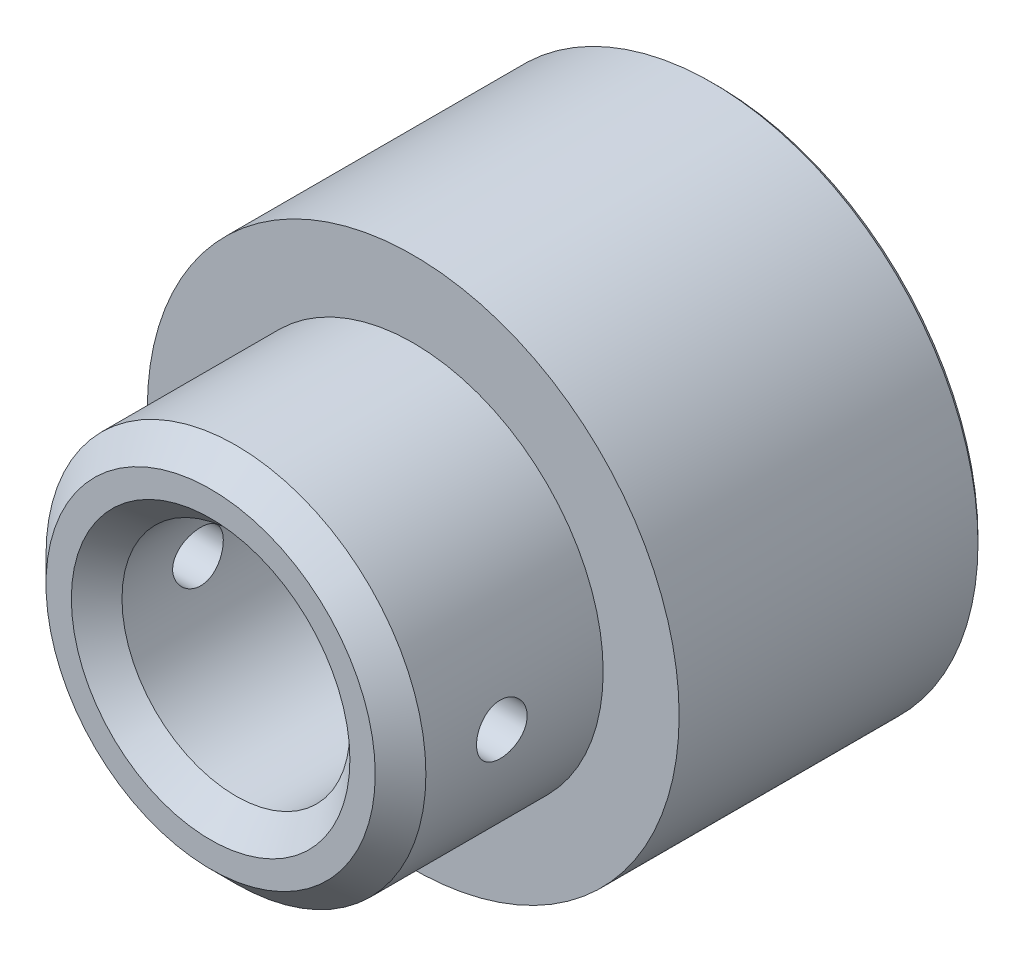
ISO-10303-21;
HEADER;
FILE_DESCRIPTION(('STEP AP214'),'2;1');
FILE_NAME('part.step','',(''),(''),'','','');
FILE_SCHEMA(('AUTOMOTIVE_DESIGN { 1 0 10303 214 1 1 1 1 }'));
ENDSEC;
DATA;
#1=APPLICATION_CONTEXT('core data for automotive mechanical design processes');
#2=APPLICATION_PROTOCOL_DEFINITION('international standard','automotive_design',2000,#1);
#3=PRODUCT_CONTEXT('',#1,'mechanical');
#4=PRODUCT('Part','Part','',(#3));
#5=PRODUCT_RELATED_PRODUCT_CATEGORY('part','',(#4));
#6=PRODUCT_DEFINITION_FORMATION('','',#4);
#7=PRODUCT_DEFINITION_CONTEXT('part definition',#1,'design');
#8=PRODUCT_DEFINITION('design','',#6,#7);
#9=PRODUCT_DEFINITION_SHAPE('','',#8);
#10=(LENGTH_UNIT() NAMED_UNIT(*) SI_UNIT(.MILLI.,.METRE.));
#11=(NAMED_UNIT(*) PLANE_ANGLE_UNIT() SI_UNIT($,.RADIAN.));
#12=(NAMED_UNIT(*) SI_UNIT($,.STERADIAN.) SOLID_ANGLE_UNIT());
#13=UNCERTAINTY_MEASURE_WITH_UNIT(LENGTH_MEASURE(1.E-05),#10,'distance_accuracy_value','');
#14=(GEOMETRIC_REPRESENTATION_CONTEXT(3) GLOBAL_UNCERTAINTY_ASSIGNED_CONTEXT((#13)) GLOBAL_UNIT_ASSIGNED_CONTEXT((#10,
#11,#12)) REPRESENTATION_CONTEXT('',''));
#15=CARTESIAN_POINT('',(0.,0.,0.));
#16=DIRECTION('',(0.,0.,1.));
#17=DIRECTION('',(1.,0.,0.));
#18=AXIS2_PLACEMENT_3D('',#15,#16,#17);
#19=CARTESIAN_POINT('',(0.,0.,60.));
#20=DIRECTION('',(0.,0.,-1.));
#21=DIRECTION('',(-1.,0.,0.));
#22=AXIS2_PLACEMENT_3D('',#19,#20,#21);
#23=CYLINDRICAL_SURFACE('',#22,52.5);
#24=CARTESIAN_POINT('',(0.,0.,0.999999999999994));
#25=DIRECTION('',(0.,0.,1.));
#26=DIRECTION('',(1.,0.,0.));
#27=AXIS2_PLACEMENT_3D('',#24,#25,#26);
#28=CIRCLE('',#27,52.5);
#29=CARTESIAN_POINT('',(52.5,0.,0.999999999999994));
#30=VERTEX_POINT('',#29);
#31=EDGE_CURVE('E155',#30,#30,#28,.T.);
#32=ORIENTED_EDGE('',*,*,#31,.T.);
#33=EDGE_LOOP('',(#32));
#34=FACE_BOUND('',#33,.T.);
#35=CARTESIAN_POINT('',(0.,0.,60.));
#36=DIRECTION('',(0.,0.,1.));
#37=DIRECTION('',(1.,0.,0.));
#38=AXIS2_PLACEMENT_3D('',#35,#36,#37);
#39=CIRCLE('',#38,52.5);
#40=CARTESIAN_POINT('',(52.5,0.,60.));
#41=VERTEX_POINT('',#40);
#42=EDGE_CURVE('E149',#41,#41,#39,.T.);
#43=ORIENTED_EDGE('',*,*,#42,.F.);
#44=EDGE_LOOP('',(#43));
#45=FACE_BOUND('',#44,.T.);
#46=ADVANCED_FACE('F33',(#34,#45),#23,.T.);
#47=CARTESIAN_POINT('',(0.,0.,60.));
#48=DIRECTION('',(0.,0.,1.));
#49=DIRECTION('',(1.,0.,0.));
#50=AXIS2_PLACEMENT_3D('',#47,#48,#49);
#51=PLANE('',#50);
#52=CARTESIAN_POINT('',(0.,0.,60.));
#53=DIRECTION('',(0.,0.,1.));
#54=DIRECTION('',(1.,0.,0.));
#55=AXIS2_PLACEMENT_3D('',#52,#53,#54);
#56=CIRCLE('',#55,37.5);
#57=CARTESIAN_POINT('',(37.5,0.,60.));
#58=VERTEX_POINT('',#57);
#59=EDGE_CURVE('E146',#58,#58,#56,.T.);
#60=ORIENTED_EDGE('',*,*,#59,.F.);
#61=EDGE_LOOP('',(#60));
#62=FACE_BOUND('',#61,.T.);
#63=ORIENTED_EDGE('',*,*,#42,.T.);
#64=EDGE_LOOP('',(#63));
#65=FACE_BOUND('',#64,.T.);
#66=ADVANCED_FACE('F96',(#62,#65),#51,.T.);
#67=CARTESIAN_POINT('',(0.,0.,0.));
#68=DIRECTION('',(0.,0.,1.));
#69=DIRECTION('',(1.,0.,0.));
#70=AXIS2_PLACEMENT_3D('',#67,#68,#69);
#71=PLANE('',#70);
#72=CARTESIAN_POINT('',(0.,0.,0.));
#73=DIRECTION('',(0.,0.,1.));
#74=DIRECTION('',(1.,0.,0.));
#75=AXIS2_PLACEMENT_3D('',#72,#73,#74);
#76=CIRCLE('',#75,51.5);
#77=CARTESIAN_POINT('',(51.5,0.,0.));
#78=VERTEX_POINT('',#77);
#79=EDGE_CURVE('E162',#78,#78,#76,.F.);
#80=ORIENTED_EDGE('',*,*,#79,.T.);
#81=EDGE_LOOP('',(#80));
#82=FACE_BOUND('',#81,.T.);
#83=CARTESIAN_POINT('',(0.,0.,0.));
#84=DIRECTION('',(0.,0.,1.));
#85=DIRECTION('',(1.,0.,0.));
#86=AXIS2_PLACEMENT_3D('',#83,#84,#85);
#87=CIRCLE('',#86,43.5);
#88=CARTESIAN_POINT('',(43.5,0.,0.));
#89=VERTEX_POINT('',#88);
#90=EDGE_CURVE('E159',#89,#89,#87,.T.);
#91=ORIENTED_EDGE('',*,*,#90,.T.);
#92=EDGE_LOOP('',(#91));
#93=FACE_BOUND('',#92,.T.);
#94=ADVANCED_FACE('F94',(#82,#93),#71,.F.);
#95=CARTESIAN_POINT('',(0.,0.,100.));
#96=DIRECTION('',(0.,0.,-1.));
#97=DIRECTION('',(-1.,0.,0.));
#98=AXIS2_PLACEMENT_3D('',#95,#96,#97);
#99=CYLINDRICAL_SURFACE('',#98,37.5);
#100=CARTESIAN_POINT('',(0.,0.,95.));
#101=DIRECTION('',(0.,0.,1.));
#102=DIRECTION('',(1.,0.,0.));
#103=AXIS2_PLACEMENT_3D('',#100,#101,#102);
#104=CIRCLE('',#103,37.5);
#105=CARTESIAN_POINT('',(37.5,0.,95.));
#106=VERTEX_POINT('',#105);
#107=EDGE_CURVE('E40',#106,#106,#104,.F.);
#108=ORIENTED_EDGE('',*,*,#107,.T.);
#109=EDGE_LOOP('',(#108));
#110=FACE_BOUND('',#109,.T.);
#111=CARTESIAN_POINT('',(-37.5,0.,85.));
#112=CARTESIAN_POINT('',(-37.5000006035784,-0.139809857161941,85.0000016964841));
#113=CARTESIAN_POINT('',(-37.4992166043786,-0.279595172641454,84.9941339147014));
#114=CARTESIAN_POINT('',(-37.4961038038827,-0.558209611683406,84.9707084393415));
#115=CARTESIAN_POINT('',(-37.4937746602546,-0.697038516461321,84.9531481552464));
#116=CARTESIAN_POINT('',(-37.4876339352639,-0.972801317522203,84.9064479289502));
#117=CARTESIAN_POINT('',(-37.483821279974,-1.10973376640755,84.8772995977261));
#118=CARTESIAN_POINT('',(-37.4748195285748,-1.38068148762459,84.8076284796766));
#119=CARTESIAN_POINT('',(-37.4696299281757,-1.51469567167939,84.7671015252497));
#120=CARTESIAN_POINT('',(-37.4580270104952,-1.77866517944389,84.6750261124037));
#121=CARTESIAN_POINT('',(-37.4516150142465,-1.90862471015347,84.6234895447968));
#122=CARTESIAN_POINT('',(-37.4377404728693,-2.16377442653378,84.5097226652735));
#123=CARTESIAN_POINT('',(-37.4302775409615,-2.28896283462189,84.4474884143851));
#124=CARTESIAN_POINT('',(-37.4145154352324,-2.53358466180885,84.3128218341247));
#125=CARTESIAN_POINT('',(-37.4062167138416,-2.65302114333451,84.2403950138577));
#126=CARTESIAN_POINT('',(-37.3890073442538,-2.88543153803738,84.085801110365));
#127=CARTESIAN_POINT('',(-37.3800964698529,-2.99840303368927,84.0036304183355));
#128=CARTESIAN_POINT('',(-37.3618659704914,-3.21762873248845,83.8296926062331));
#129=CARTESIAN_POINT('',(-37.3525444611663,-3.3238449556724,83.7378778118437));
#130=CARTESIAN_POINT('',(-37.3337946917017,-3.52821633618742,83.5456142115876));
#131=CARTESIAN_POINT('',(-37.3243663933499,-3.62636849713842,83.445162224501));
#132=CARTESIAN_POINT('',(-37.3056749300062,-3.81385543391411,83.2363845917573));
#133=CARTESIAN_POINT('',(-37.2964117139836,-3.90319297468565,83.1280614337407));
#134=CARTESIAN_POINT('',(-37.2783056025132,-4.07249114449238,82.9042236087622));
#135=CARTESIAN_POINT('',(-37.2694628633793,-4.15244830229266,82.7887063036434));
#136=CARTESIAN_POINT('',(-37.2524226807134,-4.30264336164983,82.5509027817785));
#137=CARTESIAN_POINT('',(-37.2442275986426,-4.37284634478348,82.428594334427));
#138=CARTESIAN_POINT('',(-37.228749776666,-4.50271791105839,82.1783959136371));
#139=CARTESIAN_POINT('',(-37.2214673767056,-4.56238257237184,82.0505038842631));
#140=CARTESIAN_POINT('',(-37.2080323864431,-4.67068653301889,81.7901256093804));
#141=CARTESIAN_POINT('',(-37.2018793411033,-4.71933027474225,81.6576412399027));
#142=CARTESIAN_POINT('',(-37.1908748711901,-4.80527579014029,81.3889764477635));
#143=CARTESIAN_POINT('',(-37.1860239242294,-4.84257340269532,81.2527946890044));
#144=CARTESIAN_POINT('',(-37.1737079392626,-4.93656175023383,80.8418942123888));
#145=CARTESIAN_POINT('',(-37.1683811858736,-4.97611579552635,80.5629679374244));
#146=CARTESIAN_POINT('',(-37.164113738729,-5.00788132323699,80.0025420291667));
#147=CARTESIAN_POINT('',(-37.1651727539045,-5.00009496347089,79.7210425137479));
#148=CARTESIAN_POINT('',(-37.1735145714914,-4.93768985074462,79.1652084601789));
#149=CARTESIAN_POINT('',(-37.1807567970259,-4.88337642057536,78.8908391995106));
#150=CARTESIAN_POINT('',(-37.2005886378971,-4.72991913360118,78.355154883806));
#151=CARTESIAN_POINT('',(-37.2131783751565,-4.63077425464099,78.0938401265626));
#152=CARTESIAN_POINT('',(-37.2423315766249,-4.39014795461965,77.5907267273243));
#153=CARTESIAN_POINT('',(-37.2589073661903,-4.24853487441533,77.3489917902115));
#154=CARTESIAN_POINT('',(-37.2941558924048,-3.92708490703946,76.8926020769972));
#155=CARTESIAN_POINT('',(-37.3128287380671,-3.74724603230753,76.6779487099343));
#156=CARTESIAN_POINT('',(-37.3503474843885,-3.35276223075558,76.2800425276878));
#157=CARTESIAN_POINT('',(-37.3691935894807,-3.13785426223238,76.0970504090859));
#158=CARTESIAN_POINT('',(-37.4047980945058,-2.68023543066728,75.7696948718373));
#159=CARTESIAN_POINT('',(-37.4215564884248,-2.43752448753739,75.6253315644671));
#160=CARTESIAN_POINT('',(-37.4511098438437,-1.93098054789413,75.379327209989));
#161=CARTESIAN_POINT('',(-37.4639031802894,-1.66713894671185,75.2777036734364));
#162=CARTESIAN_POINT('',(-37.4840706475363,-1.12592731123183,75.120276701517));
#163=CARTESIAN_POINT('',(-37.4914450672404,-0.848557998988532,75.0644708234184));
#164=CARTESIAN_POINT('',(-37.4999060344292,-0.290417258182221,75.0006039180554));
#165=CARTESIAN_POINT('',(-37.5010398461927,-0.00968758622736274,74.9921839944383));
#166=CARTESIAN_POINT('',(-37.4970197884964,0.549179042906562,75.0223791614209));
#167=CARTESIAN_POINT('',(-37.4918660718566,0.827316062935105,75.0609931088511));
#168=CARTESIAN_POINT('',(-37.4758793838114,1.37203428935979,75.1838616290813));
#169=CARTESIAN_POINT('',(-37.4650678570428,1.63865504284749,75.2679439044186));
#170=CARTESIAN_POINT('',(-37.4389752318875,2.15401274541647,75.4791824312302));
#171=CARTESIAN_POINT('',(-37.4236939629659,2.40274901169671,75.6063403262052));
#172=CARTESIAN_POINT('',(-37.3902459322604,2.87687220241664,75.9009803274296));
#173=CARTESIAN_POINT('',(-37.3720628686903,3.10211455798003,76.0686931840303));
#174=CARTESIAN_POINT('',(-37.3348932252024,3.52138234549022,76.4393585533241));
#175=CARTESIAN_POINT('',(-37.3159066088361,3.71540635947636,76.6423126658316));
#176=CARTESIAN_POINT('',(-37.2791225338362,4.06801381819454,77.0792819914668));
#177=CARTESIAN_POINT('',(-37.261333614562,4.22635849949015,77.3134906783304));
#178=CARTESIAN_POINT('',(-37.2291034298635,4.50145846771057,77.805401764145));
#179=CARTESIAN_POINT('',(-37.214662089687,4.61821468334676,78.0631036383088));
#180=CARTESIAN_POINT('',(-37.190819904382,4.80644706354516,78.5938810519869));
#181=CARTESIAN_POINT('',(-37.1814044018275,4.87805501107639,78.8669092908674));
#182=CARTESIAN_POINT('',(-37.168645171367,4.97436238892195,79.4214040000785));
#183=CARTESIAN_POINT('',(-37.1653011186887,4.99906432832376,79.7028700182387));
#184=CARTESIAN_POINT('',(-37.1651127634092,5.00042688871785,80.1237808661453));
#185=CARTESIAN_POINT('',(-37.165843851816,4.99501216960199,80.2633898740717));
#186=CARTESIAN_POINT('',(-37.1688591219892,4.97253184958063,80.5416357480289));
#187=CARTESIAN_POINT('',(-37.1711427243797,4.95547059498609,80.6802729572283));
#188=CARTESIAN_POINT('',(-37.1772010305187,4.90981100429212,80.9556423760262));
#189=CARTESIAN_POINT('',(-37.1809762749051,4.88120848504187,81.0923738762874));
#190=CARTESIAN_POINT('',(-37.1899068333592,4.81269401595574,81.3628764788086));
#191=CARTESIAN_POINT('',(-37.1950616463805,4.77278617180068,81.4966486368146));
#192=CARTESIAN_POINT('',(-37.2066042119064,4.68195430652272,81.7603258008377));
#193=CARTESIAN_POINT('',(-37.212991823618,4.63103154328916,81.8902312465029));
#194=CARTESIAN_POINT('',(-37.2268163237538,4.51855658876873,82.1452410946667));
#195=CARTESIAN_POINT('',(-37.2342528320251,4.4570082467209,82.2703472157864));
#196=CARTESIAN_POINT('',(-37.2499699958554,4.32368363022057,82.5149897801875));
#197=CARTESIAN_POINT('',(-37.2582509643222,4.25190356053781,82.6345241348163));
#198=CARTESIAN_POINT('',(-37.2754192205796,4.09866580761584,82.8671111884256));
#199=CARTESIAN_POINT('',(-37.2843062906605,4.01721159158497,82.9801661881948));
#200=CARTESIAN_POINT('',(-37.3025138234237,3.84448451679711,83.1999418631707));
#201=CARTESIAN_POINT('',(-37.3118371759042,3.75313857242223,83.3066048676036));
#202=CARTESIAN_POINT('',(-37.330584150837,3.56184184352336,83.5118305479989));
#203=CARTESIAN_POINT('',(-37.3400077358127,3.46189418245564,83.6103961390955));
#204=CARTESIAN_POINT('',(-37.3586991263206,3.25399690729604,83.798841802656));
#205=CARTESIAN_POINT('',(-37.367966834608,3.14604250986813,83.8887166080566));
#206=CARTESIAN_POINT('',(-37.3860766652253,2.92297556799256,84.0590516052954));
#207=CARTESIAN_POINT('',(-37.394918943501,2.80786568247649,84.1395152626033));
#208=CARTESIAN_POINT('',(-37.4119731315671,2.57069345067363,84.2908525870795));
#209=CARTESIAN_POINT('',(-37.4201818802072,2.44860094515718,84.3616793590073));
#210=CARTESIAN_POINT('',(-37.4356865483206,2.1988673779508,84.4927567149454));
#211=CARTESIAN_POINT('',(-37.4429828025999,2.07122837464114,84.5530111813588));
#212=CARTESIAN_POINT('',(-37.4564531746305,1.81135973412983,84.6624925810083));
#213=CARTESIAN_POINT('',(-37.462628150195,1.67913369918062,84.7117279509595));
#214=CARTESIAN_POINT('',(-37.473685750318,1.41098911378825,84.7988525254573));
#215=CARTESIAN_POINT('',(-37.4785686748438,1.27507142850613,84.8367443638282));
#216=CARTESIAN_POINT('',(-37.4883875197009,0.951549337616055,84.912341127651));
#217=CARTESIAN_POINT('',(-37.4927236192826,0.762768081383299,84.9451784824949));
#218=CARTESIAN_POINT('',(-37.4985294338594,0.382642552902599,84.9890066616871));
#219=CARTESIAN_POINT('',(-37.4999991741389,0.191298303278015,84.9999976787436));
#220=CARTESIAN_POINT('',(-37.5,0.,85.));
#221=B_SPLINE_CURVE_WITH_KNOTS('',3,(#111,#112,#113,#114,#115,#116,#117,#118,#119,#120,#121,
#122,#123,#124,#125,#126,#127,#128,#129,#130,#131,#132,#133,#134,#135,#136,#137,#138,#139,#140,
#141,#142,#143,#144,#145,#146,#147,#148,#149,#150,#151,#152,#153,#154,#155,#156,#157,#158,#159,
#160,#161,#162,#163,#164,#165,#166,#167,#168,#169,#170,#171,#172,#173,#174,#175,#176,#177,#178,
#179,#180,#181,#182,#183,#184,#185,#186,#187,#188,#189,#190,#191,#192,#193,#194,#195,#196,#197,
#198,#199,#200,#201,#202,#203,#204,#205,#206,#207,#208,#209,#210,#211,#212,#213,#214,#215,#216,
#217,#218,#219,#220),.UNSPECIFIED.,.T.,.F.,(4,2,2,2,2,2,2,2,2,2,2,2,2,2,2,2,2,2,2,2,2,2,2,2,2,2,
2,2,2,2,2,2,2,2,2,2,2,2,2,2,2,2,2,2,2,2,2,2,2,2,2,2,2,2,4),(0.,0.419262120559973,
0.838617161143729,1.25827634305797,1.67808943278332,2.09745137984392,2.51696807136685,
2.93625887795984,3.35570546372761,3.77733292157984,4.1991163424674,4.62076703599578,
5.04257327353928,5.46585261350656,5.8892891461461,6.31255469213693,6.73597528141105,
7.57687073511492,8.41772786037894,9.25310896470703,10.0885091166522,10.9265264157034,
11.7645872983509,12.6092504493772,13.4539160335633,14.2989273423194,15.1438935970495,
15.9824514620575,16.8209889461179,17.6563709221675,18.4917847748446,19.3320687065031,
20.172390793725,21.0181794506422,21.8639492190821,22.7072387056423,23.5504830818468,
23.9692230560844,24.3878068482622,24.806542493317,25.2251262634094,25.6436622569952,
26.0620469480099,26.4805872352611,26.8989779680289,27.3207035244164,27.7422765847367,
28.1641035594344,28.5857747123536,29.0094295472959,29.4329284789613,29.8561020430301,
30.2791772752092,30.8528481265814,31.4265139175347),.UNSPECIFIED.);
#222=CARTESIAN_POINT('',(-37.5,0.,85.));
#223=VERTEX_POINT('',#222);
#224=EDGE_CURVE('E84',#223,#223,#221,.T.);
#225=ORIENTED_EDGE('',*,*,#224,.T.);
#226=EDGE_LOOP('',(#225));
#227=FACE_BOUND('',#226,.T.);
#228=CARTESIAN_POINT('',(37.5,0.,75.));
#229=CARTESIAN_POINT('',(37.5000006035784,-0.139809857161942,74.9999983035159));
#230=CARTESIAN_POINT('',(37.4992166043786,-0.279595172641455,75.0058660852986));
#231=CARTESIAN_POINT('',(37.4961038038827,-0.558209611683408,75.0292915606585));
#232=CARTESIAN_POINT('',(37.4937746602546,-0.697038516461323,75.0468518447536));
#233=CARTESIAN_POINT('',(37.4876339352639,-0.972801317522204,75.0935520710498));
#234=CARTESIAN_POINT('',(37.483821279974,-1.10973376640755,75.1227004022739));
#235=CARTESIAN_POINT('',(37.4748195285748,-1.38068148762459,75.1923715203234));
#236=CARTESIAN_POINT('',(37.4696299281757,-1.51469567167939,75.2328984747503));
#237=CARTESIAN_POINT('',(37.4580270104952,-1.77866517944389,75.3249738875963));
#238=CARTESIAN_POINT('',(37.4516150142465,-1.90862471015347,75.3765104552032));
#239=CARTESIAN_POINT('',(37.4377404728693,-2.16377442653378,75.4902773347265));
#240=CARTESIAN_POINT('',(37.4302775409615,-2.28896283462189,75.5525115856149));
#241=CARTESIAN_POINT('',(37.4145154352324,-2.53358466180885,75.6871781658753));
#242=CARTESIAN_POINT('',(37.4062167138416,-2.65302114333451,75.7596049861423));
#243=CARTESIAN_POINT('',(37.3890073442538,-2.88543153803738,75.914198889635));
#244=CARTESIAN_POINT('',(37.3800964698529,-2.99840303368927,75.9963695816645));
#245=CARTESIAN_POINT('',(37.3618659704914,-3.21762873248845,76.1703073937669));
#246=CARTESIAN_POINT('',(37.3525444611663,-3.3238449556724,76.2621221881563));
#247=CARTESIAN_POINT('',(37.3337946917017,-3.52821633618742,76.4543857884124));
#248=CARTESIAN_POINT('',(37.3243663933499,-3.62636849713842,76.554837775499));
#249=CARTESIAN_POINT('',(37.3056749300062,-3.81385543391411,76.7636154082427));
#250=CARTESIAN_POINT('',(37.2964117139836,-3.90319297468565,76.8719385662593));
#251=CARTESIAN_POINT('',(37.2783056025132,-4.07249114449238,77.0957763912378));
#252=CARTESIAN_POINT('',(37.2694628633793,-4.15244830229265,77.2112936963566));
#253=CARTESIAN_POINT('',(37.2524226807134,-4.30264336164983,77.4490972182215));
#254=CARTESIAN_POINT('',(37.2442275986426,-4.37284634478348,77.571405665573));
#255=CARTESIAN_POINT('',(37.228749776666,-4.50271791105838,77.8216040863629));
#256=CARTESIAN_POINT('',(37.2214673767056,-4.56238257237183,77.9494961157369));
#257=CARTESIAN_POINT('',(37.2080323864431,-4.67068653301889,78.2098743906196));
#258=CARTESIAN_POINT('',(37.2018793411033,-4.71933027474225,78.3423587600973));
#259=CARTESIAN_POINT('',(37.1908748711901,-4.80527579014029,78.6110235522365));
#260=CARTESIAN_POINT('',(37.1860239242294,-4.84257340269532,78.7472053109956));
#261=CARTESIAN_POINT('',(37.1737079392626,-4.93656175023383,79.1581057876112));
#262=CARTESIAN_POINT('',(37.1683811858736,-4.97611579552634,79.4370320625756));
#263=CARTESIAN_POINT('',(37.164113738729,-5.00788132323699,79.9974579708333));
#264=CARTESIAN_POINT('',(37.1651727539045,-5.00009496347089,80.2789574862521));
#265=CARTESIAN_POINT('',(37.1735145714914,-4.93768985074462,80.8347915398211));
#266=CARTESIAN_POINT('',(37.1807567970259,-4.88337642057536,81.1091608004894));
#267=CARTESIAN_POINT('',(37.2005886378971,-4.72991913360118,81.6448451161941));
#268=CARTESIAN_POINT('',(37.2131783751565,-4.63077425464098,81.9061598734374));
#269=CARTESIAN_POINT('',(37.2423315766249,-4.39014795461965,82.4092732726757));
#270=CARTESIAN_POINT('',(37.2589073661903,-4.24853487441533,82.6510082097885));
#271=CARTESIAN_POINT('',(37.2941558924048,-3.92708490703946,83.1073979230028));
#272=CARTESIAN_POINT('',(37.3128287380671,-3.74724603230753,83.3220512900657));
#273=CARTESIAN_POINT('',(37.3503474843885,-3.35276223075558,83.7199574723122));
#274=CARTESIAN_POINT('',(37.3691935894807,-3.13785426223238,83.9029495909141));
#275=CARTESIAN_POINT('',(37.4047980945058,-2.68023543066728,84.2303051281627));
#276=CARTESIAN_POINT('',(37.4215564884248,-2.43752448753739,84.3746684355329));
#277=CARTESIAN_POINT('',(37.4511098438437,-1.93098054789413,84.620672790011));
#278=CARTESIAN_POINT('',(37.4639031802894,-1.66713894671185,84.7222963265636));
#279=CARTESIAN_POINT('',(37.4840706475363,-1.12592731123183,84.879723298483));
#280=CARTESIAN_POINT('',(37.4914450672404,-0.848557998988532,84.9355291765816));
#281=CARTESIAN_POINT('',(37.4999060344292,-0.290417258182221,84.9993960819446));
#282=CARTESIAN_POINT('',(37.5010398461927,-0.00968758622736274,85.0078160055617));
#283=CARTESIAN_POINT('',(37.4970197884964,0.549179042906562,84.9776208385791));
#284=CARTESIAN_POINT('',(37.4918660718566,0.827316062935105,84.9390068911489));
#285=CARTESIAN_POINT('',(37.4758793838114,1.37203428935979,84.8161383709187));
#286=CARTESIAN_POINT('',(37.4650678570428,1.63865504284749,84.7320560955814));
#287=CARTESIAN_POINT('',(37.4389752318875,2.15401274541647,84.5208175687698));
#288=CARTESIAN_POINT('',(37.4236939629659,2.40274901169671,84.3936596737948));
#289=CARTESIAN_POINT('',(37.3902459322604,2.87687220241664,84.0990196725704));
#290=CARTESIAN_POINT('',(37.3720628686903,3.10211455798003,83.9313068159697));
#291=CARTESIAN_POINT('',(37.3348932252024,3.52138234549022,83.5606414466759));
#292=CARTESIAN_POINT('',(37.3159066088361,3.71540635947636,83.3576873341685));
#293=CARTESIAN_POINT('',(37.2791225338362,4.06801381819454,82.9207180085332));
#294=CARTESIAN_POINT('',(37.261333614562,4.22635849949015,82.6865093216697));
#295=CARTESIAN_POINT('',(37.2291034298635,4.50145846771057,82.194598235855));
#296=CARTESIAN_POINT('',(37.214662089687,4.61821468334676,81.9368963616912));
#297=CARTESIAN_POINT('',(37.190819904382,4.80644706354516,81.4061189480131));
#298=CARTESIAN_POINT('',(37.1814044018275,4.87805501107639,81.1330907091326));
#299=CARTESIAN_POINT('',(37.168645171367,4.97436238892195,80.5785959999215));
#300=CARTESIAN_POINT('',(37.1653011186887,4.99906432832376,80.2971299817613));
#301=CARTESIAN_POINT('',(37.1651127634092,5.00042688871785,79.8762191338547));
#302=CARTESIAN_POINT('',(37.165843851816,4.99501216960199,79.7366101259283));
#303=CARTESIAN_POINT('',(37.1688591219892,4.97253184958063,79.4583642519712));
#304=CARTESIAN_POINT('',(37.1711427243797,4.95547059498609,79.3197270427717));
#305=CARTESIAN_POINT('',(37.1772010305187,4.90981100429212,79.0443576239738));
#306=CARTESIAN_POINT('',(37.1809762749051,4.88120848504187,78.9076261237126));
#307=CARTESIAN_POINT('',(37.1899068333592,4.81269401595574,78.6371235211914));
#308=CARTESIAN_POINT('',(37.1950616463805,4.77278617180069,78.5033513631855));
#309=CARTESIAN_POINT('',(37.2066042119064,4.68195430652272,78.2396741991623));
#310=CARTESIAN_POINT('',(37.212991823618,4.63103154328916,78.1097687534971));
#311=CARTESIAN_POINT('',(37.2268163237538,4.51855658876873,77.8547589053333));
#312=CARTESIAN_POINT('',(37.2342528320251,4.4570082467209,77.7296527842136));
#313=CARTESIAN_POINT('',(37.2499699958554,4.32368363022057,77.4850102198125));
#314=CARTESIAN_POINT('',(37.2582509643222,4.25190356053781,77.3654758651837));
#315=CARTESIAN_POINT('',(37.2754192205796,4.09866580761584,77.1328888115744));
#316=CARTESIAN_POINT('',(37.2843062906605,4.01721159158497,77.0198338118052));
#317=CARTESIAN_POINT('',(37.3025138234237,3.84448451679711,76.8000581368293));
#318=CARTESIAN_POINT('',(37.3118371759042,3.75313857242222,76.6933951323964));
#319=CARTESIAN_POINT('',(37.330584150837,3.56184184352335,76.4881694520011));
#320=CARTESIAN_POINT('',(37.3400077358127,3.46189418245564,76.3896038609045));
#321=CARTESIAN_POINT('',(37.3586991263206,3.25399690729603,76.201158197344));
#322=CARTESIAN_POINT('',(37.367966834608,3.14604250986812,76.1112833919434));
#323=CARTESIAN_POINT('',(37.3860766652253,2.92297556799255,75.9409483947046));
#324=CARTESIAN_POINT('',(37.394918943501,2.80786568247649,75.8604847373967));
#325=CARTESIAN_POINT('',(37.4119731315671,2.57069345067363,75.7091474129205));
#326=CARTESIAN_POINT('',(37.4201818802072,2.44860094515718,75.6383206409927));
#327=CARTESIAN_POINT('',(37.4356865483206,2.1988673779508,75.5072432850546));
#328=CARTESIAN_POINT('',(37.4429828025999,2.07122837464115,75.4469888186412));
#329=CARTESIAN_POINT('',(37.4564531746305,1.81135973412984,75.3375074189917));
#330=CARTESIAN_POINT('',(37.462628150195,1.67913369918062,75.2882720490405));
#331=CARTESIAN_POINT('',(37.473685750318,1.41098911378825,75.2011474745427));
#332=CARTESIAN_POINT('',(37.4785686748438,1.27507142850614,75.1632556361718));
#333=CARTESIAN_POINT('',(37.4883875197009,0.951549337616055,75.087658872349));
#334=CARTESIAN_POINT('',(37.4927236192826,0.762768081383299,75.0548215175051));
#335=CARTESIAN_POINT('',(37.4985294338594,0.382642552902599,75.0109933383129));
#336=CARTESIAN_POINT('',(37.4999991741389,0.191298303278015,75.0000023212564));
#337=CARTESIAN_POINT('',(37.5,0.,75.));
#338=B_SPLINE_CURVE_WITH_KNOTS('',3,(#228,#229,#230,#231,#232,#233,#234,#235,#236,#237,#238,
#239,#240,#241,#242,#243,#244,#245,#246,#247,#248,#249,#250,#251,#252,#253,#254,#255,#256,#257,
#258,#259,#260,#261,#262,#263,#264,#265,#266,#267,#268,#269,#270,#271,#272,#273,#274,#275,#276,
#277,#278,#279,#280,#281,#282,#283,#284,#285,#286,#287,#288,#289,#290,#291,#292,#293,#294,#295,
#296,#297,#298,#299,#300,#301,#302,#303,#304,#305,#306,#307,#308,#309,#310,#311,#312,#313,#314,
#315,#316,#317,#318,#319,#320,#321,#322,#323,#324,#325,#326,#327,#328,#329,#330,#331,#332,#333,
#334,#335,#336,#337),.UNSPECIFIED.,.T.,.F.,(4,2,2,2,2,2,2,2,2,2,2,2,2,2,2,2,2,2,2,2,2,2,2,2,2,2,
2,2,2,2,2,2,2,2,2,2,2,2,2,2,2,2,2,2,2,2,2,2,2,2,2,2,2,2,4),(0.,0.419262120559974,
0.838617161143731,1.25827634305797,1.67808943278332,2.09745137984392,2.51696807136685,
2.93625887795984,3.35570546372761,3.77733292157984,4.1991163424674,4.62076703599578,
5.04257327353928,5.46585261350653,5.88928914614608,6.31255469213693,6.73597528141105,
7.57687073511491,8.41772786037894,9.25310896470704,10.0885091166522,10.9265264157034,
11.7645872983509,12.6092504493772,13.4539160335633,14.2989273423194,15.1438935970495,
15.9824514620575,16.8209889461179,17.6563709221675,18.4917847748446,19.3320687065031,
20.172390793725,21.0181794506422,21.8639492190821,22.7072387056423,23.5504830818468,
23.9692230560844,24.3878068482621,24.8065424933169,25.2251262634094,25.6436622569952,
26.0620469480099,26.4805872352611,26.8989779680289,27.3207035244165,27.7422765847367,
28.1641035594344,28.5857747123536,29.0094295472959,29.4329284789613,29.8561020430301,
30.2791772752092,30.8528481265814,31.4265139175347),.UNSPECIFIED.);
#339=CARTESIAN_POINT('',(37.5,0.,75.));
#340=VERTEX_POINT('',#339);
#341=EDGE_CURVE('E61',#340,#340,#338,.T.);
#342=ORIENTED_EDGE('',*,*,#341,.T.);
#343=EDGE_LOOP('',(#342));
#344=FACE_BOUND('',#343,.T.);
#345=ORIENTED_EDGE('',*,*,#59,.T.);
#346=EDGE_LOOP('',(#345));
#347=FACE_BOUND('',#346,.T.);
#348=ADVANCED_FACE('F88',(#110,#227,#344,#347),#99,.T.);
#349=CARTESIAN_POINT('',(0.,0.,100.));
#350=DIRECTION('',(0.,0.,1.));
#351=DIRECTION('',(1.,0.,0.));
#352=AXIS2_PLACEMENT_3D('',#349,#350,#351);
#353=PLANE('',#352);
#354=CARTESIAN_POINT('',(0.,0.,100.));
#355=DIRECTION('',(0.,0.,1.));
#356=DIRECTION('',(1.,0.,0.));
#357=AXIS2_PLACEMENT_3D('',#354,#355,#356);
#358=CIRCLE('',#357,32.5);
#359=CARTESIAN_POINT('',(32.5,0.,100.));
#360=VERTEX_POINT('',#359);
#361=EDGE_CURVE('E44',#360,#360,#358,.T.);
#362=ORIENTED_EDGE('',*,*,#361,.T.);
#363=EDGE_LOOP('',(#362));
#364=FACE_BOUND('',#363,.T.);
#365=CARTESIAN_POINT('',(0.,0.,100.));
#366=DIRECTION('',(0.,0.,1.));
#367=DIRECTION('',(1.,0.,0.));
#368=AXIS2_PLACEMENT_3D('',#365,#366,#367);
#369=CIRCLE('',#368,27.5);
#370=CARTESIAN_POINT('',(27.5,0.,100.));
#371=VERTEX_POINT('',#370);
#372=EDGE_CURVE('E48',#371,#371,#369,.F.);
#373=ORIENTED_EDGE('',*,*,#372,.T.);
#374=EDGE_LOOP('',(#373));
#375=FACE_BOUND('',#374,.T.);
#376=ADVANCED_FACE('F93',(#364,#375),#353,.T.);
#377=CARTESIAN_POINT('',(0.,0.,40.));
#378=DIRECTION('',(0.,0.,-1.));
#379=DIRECTION('',(-1.,0.,0.));
#380=AXIS2_PLACEMENT_3D('',#377,#378,#379);
#381=CYLINDRICAL_SURFACE('',#380,42.5);
#382=CARTESIAN_POINT('',(0.,0.,1.00000000000001));
#383=DIRECTION('',(0.,0.,1.));
#384=DIRECTION('',(1.,0.,0.));
#385=AXIS2_PLACEMENT_3D('',#382,#383,#384);
#386=CIRCLE('',#385,42.5);
#387=CARTESIAN_POINT('',(42.5,0.,1.00000000000001));
#388=VERTEX_POINT('',#387);
#389=EDGE_CURVE('E53',#388,#388,#386,.F.);
#390=ORIENTED_EDGE('',*,*,#389,.T.);
#391=EDGE_LOOP('',(#390));
#392=FACE_BOUND('',#391,.T.);
#393=CARTESIAN_POINT('',(0.,0.,40.));
#394=DIRECTION('',(0.,0.,-1.));
#395=DIRECTION('',(-1.,0.,0.));
#396=AXIS2_PLACEMENT_3D('',#393,#394,#395);
#397=CIRCLE('',#396,42.5);
#398=CARTESIAN_POINT('',(-42.5,0.,40.));
#399=VERTEX_POINT('',#398);
#400=EDGE_CURVE('E144',#399,#399,#397,.T.);
#401=ORIENTED_EDGE('',*,*,#400,.F.);
#402=EDGE_LOOP('',(#401));
#403=FACE_BOUND('',#402,.T.);
#404=ADVANCED_FACE('F127',(#392,#403),#381,.F.);
#405=CARTESIAN_POINT('',(0.,0.,40.));
#406=DIRECTION('',(0.,0.,-1.));
#407=DIRECTION('',(-1.,0.,0.));
#408=AXIS2_PLACEMENT_3D('',#405,#406,#407);
#409=PLANE('',#408);
#410=CARTESIAN_POINT('',(0.,0.,40.));
#411=DIRECTION('',(0.,0.,-1.));
#412=DIRECTION('',(-1.,0.,0.));
#413=AXIS2_PLACEMENT_3D('',#410,#411,#412);
#414=CIRCLE('',#413,22.5);
#415=CARTESIAN_POINT('',(-22.5,0.,40.));
#416=VERTEX_POINT('',#415);
#417=EDGE_CURVE('E147',#416,#416,#414,.T.);
#418=ORIENTED_EDGE('',*,*,#417,.F.);
#419=EDGE_LOOP('',(#418));
#420=FACE_BOUND('',#419,.T.);
#421=ORIENTED_EDGE('',*,*,#400,.T.);
#422=EDGE_LOOP('',(#421));
#423=FACE_BOUND('',#422,.T.);
#424=ADVANCED_FACE('F133',(#420,#423),#409,.T.);
#425=CARTESIAN_POINT('',(0.,0.,0.));
#426=DIRECTION('',(0.,0.,1.));
#427=DIRECTION('',(1.,0.,0.));
#428=AXIS2_PLACEMENT_3D('',#425,#426,#427);
#429=CYLINDRICAL_SURFACE('',#428,22.5);
#430=CARTESIAN_POINT('',(0.,0.,95.));
#431=DIRECTION('',(0.,0.,1.));
#432=DIRECTION('',(1.,0.,0.));
#433=AXIS2_PLACEMENT_3D('',#430,#431,#432);
#434=CIRCLE('',#433,22.5);
#435=CARTESIAN_POINT('',(22.5,0.,95.));
#436=VERTEX_POINT('',#435);
#437=EDGE_CURVE('E10',#436,#436,#434,.T.);
#438=ORIENTED_EDGE('',*,*,#437,.T.);
#439=EDGE_LOOP('',(#438));
#440=FACE_BOUND('',#439,.T.);
#441=CARTESIAN_POINT('',(22.5,0.,75.));
#442=CARTESIAN_POINT('',(22.4999949054563,0.277201191939121,75.0000093091996));
#443=CARTESIAN_POINT('',(22.4948253498923,0.554513913174051,75.0231299541587));
#444=CARTESIAN_POINT('',(22.4747024439418,1.10125486025784,75.1149011808764));
#445=CARTESIAN_POINT('',(22.4597422554339,1.37067743784747,75.1835835850232));
#446=CARTESIAN_POINT('',(22.421702829225,1.89365819440382,75.3642149262291));
#447=CARTESIAN_POINT('',(22.3986322109764,2.14723288025071,75.4761179424947));
#448=CARTESIAN_POINT('',(22.3468583860351,2.6320004507844,75.739866531181));
#449=CARTESIAN_POINT('',(22.3181552886865,2.86319376983337,75.8917113282266));
#450=CARTESIAN_POINT('',(22.2577273543527,3.30046578503508,76.2336891627666));
#451=CARTESIAN_POINT('',(22.2259640410261,3.50612153010881,76.4243562553376));
#452=CARTESIAN_POINT('',(22.1632650270043,3.88281227614596,76.8374201502331));
#453=CARTESIAN_POINT('',(22.132329402237,4.0538441102715,77.059819851777));
#454=CARTESIAN_POINT('',(22.0744082065066,4.35831108525865,77.5331796101448));
#455=CARTESIAN_POINT('',(22.0474718934386,4.49129355260967,77.7844373951004));
#456=CARTESIAN_POINT('',(22.0011524089458,4.71298247386312,78.3064319042344));
#457=CARTESIAN_POINT('',(21.9817683031266,4.80169440550397,78.5771662137733));
#458=CARTESIAN_POINT('',(21.9531402359799,4.93092145016118,79.1258336933053));
#459=CARTESIAN_POINT('',(21.9437386433446,4.97218667594938,79.4035817877401));
#460=CARTESIAN_POINT('',(21.9356668414216,5.00768177493916,79.9622055444361));
#461=CARTESIAN_POINT('',(21.9369952689832,5.00191762279196,80.2430808048922));
#462=CARTESIAN_POINT('',(21.9500908041844,4.94412068793337,80.794391567986));
#463=CARTESIAN_POINT('',(21.9616607847499,4.89296161150565,81.0649240603488));
#464=CARTESIAN_POINT('',(21.993623854663,4.74721226702843,81.5934678583121));
#465=CARTESIAN_POINT('',(22.0140174532947,4.65261949204123,81.8514784402134));
#466=CARTESIAN_POINT('',(22.0615227492924,4.42189182182193,82.3500985959548));
#467=CARTESIAN_POINT('',(22.0886881090716,4.28542298448384,82.5905483183402));
#468=CARTESIAN_POINT('',(22.1466434477592,3.97505170349623,83.0454571762897));
#469=CARTESIAN_POINT('',(22.1774339355124,3.80114400185686,83.2599126545503));
#470=CARTESIAN_POINT('',(22.2400143653192,3.41621709257458,83.6617732733712));
#471=CARTESIAN_POINT('',(22.2718112671975,3.20445551316559,83.8484669627626));
#472=CARTESIAN_POINT('',(22.3321959780572,2.75226654522906,84.1838093222678));
#473=CARTESIAN_POINT('',(22.3607837252105,2.51183860459343,84.3324572594547));
#474=CARTESIAN_POINT('',(22.4116266058404,2.00825797683685,84.587673189442));
#475=CARTESIAN_POINT('',(22.4338673251915,1.74505530579965,84.6941456107706));
#476=CARTESIAN_POINT('',(22.4694034091563,1.20388982745365,84.8611525326447));
#477=CARTESIAN_POINT('',(22.4827001174196,0.925929243983424,84.9216939335353));
#478=CARTESIAN_POINT('',(22.4986579440418,0.36923870820212,84.9940800331379));
#479=CARTESIAN_POINT('',(22.5015312155572,0.0906409932972702,85.0068962504042));
#480=CARTESIAN_POINT('',(22.496913966265,-0.464714809820195,84.9861047393491));
#481=CARTESIAN_POINT('',(22.4894241722617,-0.741473025676614,84.9525002667014));
#482=CARTESIAN_POINT('',(22.4650564689652,-1.28205814332355,84.8406264620798));
#483=CARTESIAN_POINT('',(22.4482861751934,-1.54599622928869,84.7628688594414));
#484=CARTESIAN_POINT('',(22.4072355271705,-2.05708201463958,84.5654657813873));
#485=CARTESIAN_POINT('',(22.3829545191188,-2.30422825002547,84.4458166592349));
#486=CARTESIAN_POINT('',(22.3290538306887,-2.77871609973591,84.1660178080027));
#487=CARTESIAN_POINT('',(22.2993611147475,-3.00571432708048,84.005300142485));
#488=CARTESIAN_POINT('',(22.2380758087357,-3.42986741247042,83.648671877246));
#489=CARTESIAN_POINT('',(22.2064829637869,-3.62701825433579,83.4527565491682));
#490=CARTESIAN_POINT('',(22.1442219736121,-3.98973870477415,83.0268299160498));
#491=CARTESIAN_POINT('',(22.1135829414823,-4.1546345485,82.7962397749894));
#492=CARTESIAN_POINT('',(22.0573848845825,-4.44336529807064,82.3100699139671));
#493=CARTESIAN_POINT('',(22.0318256378478,-4.56720199818121,82.0544912866228));
#494=CARTESIAN_POINT('',(21.9889300132591,-4.76945004740288,81.5269792772506));
#495=CARTESIAN_POINT('',(21.9715469897688,-4.84811965884861,81.255148894392));
#496=CARTESIAN_POINT('',(21.9468912408989,-4.95855069144011,80.7016895379163));
#497=CARTESIAN_POINT('',(21.9396168385988,-4.99031989295584,80.4200621974653));
#498=CARTESIAN_POINT('',(21.936110036307,-5.00570891602905,79.8618028042766));
#499=CARTESIAN_POINT('',(21.9396324581123,-4.99039782859127,79.5852012298064));
#500=CARTESIAN_POINT('',(21.956766622574,-4.91445692803306,79.0386257250505));
#501=CARTESIAN_POINT('',(21.9703782383105,-4.85382768500486,78.7686517114357));
#502=CARTESIAN_POINT('',(22.0060357036517,-4.6894954995219,78.243877199444));
#503=CARTESIAN_POINT('',(22.0280501296667,-4.58595291571223,77.9890242077993));
#504=CARTESIAN_POINT('',(22.078044111629,-4.33886925870768,77.5001500186299));
#505=CARTESIAN_POINT('',(22.1060243118894,-4.19532386462961,77.2661310750891));
#506=CARTESIAN_POINT('',(22.1655260709102,-3.8687839747642,76.820308477631));
#507=CARTESIAN_POINT('',(22.1971092842007,-3.68502963777603,76.6090694876936));
#508=CARTESIAN_POINT('',(22.2598493543275,-3.28482176486253,76.2200748151714));
#509=CARTESIAN_POINT('',(22.2910061107244,-3.06836066558357,76.0423268987289));
#510=CARTESIAN_POINT('',(22.3498814931665,-2.60536492661394,75.7230600427003));
#511=CARTESIAN_POINT('',(22.3775480874812,-2.35846409158738,75.5820620006627));
#512=CARTESIAN_POINT('',(22.4258014592307,-1.84390069944705,75.343791739547));
#513=CARTESIAN_POINT('',(22.4463940817703,-1.5762555082825,75.2464833998846));
#514=CARTESIAN_POINT('',(22.474570322739,-1.09034561932353,75.115396624308));
#515=CARTESIAN_POINT('',(22.4840467255803,-0.874679979754211,75.0722065658343));
#516=CARTESIAN_POINT('',(22.4967634364947,-0.439366124736323,75.0145052392346));
#517=CARTESIAN_POINT('',(22.5000040380903,-0.219718097232197,74.9999926212452));
#518=CARTESIAN_POINT('',(22.5,0.,75.));
#519=B_SPLINE_CURVE_WITH_KNOTS('',3,(#441,#442,#443,#444,#445,#446,#447,#448,#449,#450,#451,
#452,#453,#454,#455,#456,#457,#458,#459,#460,#461,#462,#463,#464,#465,#466,#467,#468,#469,#470,
#471,#472,#473,#474,#475,#476,#477,#478,#479,#480,#481,#482,#483,#484,#485,#486,#487,#488,#489,
#490,#491,#492,#493,#494,#495,#496,#497,#498,#499,#500,#501,#502,#503,#504,#505,#506,#507,#508,
#509,#510,#511,#512,#513,#514,#515,#516,#517,#518),.UNSPECIFIED.,.T.,.F.,(4,2,2,2,2,2,2,2,2,2,2,
2,2,2,2,2,2,2,2,2,2,2,2,2,2,2,2,2,2,2,2,2,2,2,2,2,2,2,4),(0.,0.830799224324493,1.66217932812321,
2.49267853101864,3.32316161292473,4.16595180005198,5.00881903726285,5.86133240744939,
6.71374026719351,7.55247814098694,8.39110946248412,9.21394170371395,10.0368214437428,
10.8664417428089,11.6961786315268,12.5444544952938,13.392746699315,14.2429503203503,
15.093026187619,15.9256998031761,16.758315022876,17.5814717356985,18.4047001237058,
19.2399950816204,20.0754023347633,20.9267368277126,21.7780341128296,22.6244139764775,
23.4706534172859,24.2978196287089,25.1249754347416,25.9490678005647,26.7732492148298,
27.6146081579908,28.4561619618304,29.3090646764094,30.1612609469436,30.8198086841341,
31.478325422369),.UNSPECIFIED.);
#520=CARTESIAN_POINT('',(22.5,0.,75.));
#521=VERTEX_POINT('',#520);
#522=EDGE_CURVE('E54',#521,#521,#519,.T.);
#523=ORIENTED_EDGE('',*,*,#522,.T.);
#524=EDGE_LOOP('',(#523));
#525=FACE_BOUND('',#524,.T.);
#526=CARTESIAN_POINT('',(-22.5,0.,75.));
#527=CARTESIAN_POINT('',(-22.4999949054563,-0.277201191939121,75.0000093091996));
#528=CARTESIAN_POINT('',(-22.4948253498923,-0.554513913174051,75.0231299541587));
#529=CARTESIAN_POINT('',(-22.4747024439418,-1.10125486025784,75.1149011808764));
#530=CARTESIAN_POINT('',(-22.4597422554339,-1.37067743784747,75.1835835850232));
#531=CARTESIAN_POINT('',(-22.421702829225,-1.89365819440382,75.3642149262291));
#532=CARTESIAN_POINT('',(-22.3986322109764,-2.14723288025071,75.4761179424947));
#533=CARTESIAN_POINT('',(-22.3468583860351,-2.6320004507844,75.739866531181));
#534=CARTESIAN_POINT('',(-22.3181552886865,-2.86319376983337,75.8917113282266));
#535=CARTESIAN_POINT('',(-22.2577273543527,-3.30046578503508,76.2336891627666));
#536=CARTESIAN_POINT('',(-22.2259640410261,-3.50612153010881,76.4243562553376));
#537=CARTESIAN_POINT('',(-22.1632650270043,-3.88281227614596,76.8374201502331));
#538=CARTESIAN_POINT('',(-22.132329402237,-4.0538441102715,77.059819851777));
#539=CARTESIAN_POINT('',(-22.0744082065066,-4.35831108525865,77.5331796101448));
#540=CARTESIAN_POINT('',(-22.0474718934386,-4.49129355260967,77.7844373951004));
#541=CARTESIAN_POINT('',(-22.0011524089458,-4.71298247386312,78.3064319042344));
#542=CARTESIAN_POINT('',(-21.9817683031266,-4.80169440550397,78.5771662137733));
#543=CARTESIAN_POINT('',(-21.9531402359799,-4.93092145016118,79.1258336933053));
#544=CARTESIAN_POINT('',(-21.9437386433446,-4.97218667594938,79.4035817877401));
#545=CARTESIAN_POINT('',(-21.9356668414216,-5.00768177493916,79.9622055444361));
#546=CARTESIAN_POINT('',(-21.9369952689832,-5.00191762279196,80.2430808048922));
#547=CARTESIAN_POINT('',(-21.9500908041844,-4.94412068793337,80.794391567986));
#548=CARTESIAN_POINT('',(-21.9616607847499,-4.89296161150565,81.0649240603488));
#549=CARTESIAN_POINT('',(-21.993623854663,-4.74721226702843,81.5934678583121));
#550=CARTESIAN_POINT('',(-22.0140174532947,-4.65261949204123,81.8514784402134));
#551=CARTESIAN_POINT('',(-22.0615227492924,-4.42189182182193,82.3500985959548));
#552=CARTESIAN_POINT('',(-22.0886881090716,-4.28542298448384,82.5905483183402));
#553=CARTESIAN_POINT('',(-22.1466434477592,-3.97505170349623,83.0454571762897));
#554=CARTESIAN_POINT('',(-22.1774339355124,-3.80114400185686,83.2599126545503));
#555=CARTESIAN_POINT('',(-22.2400143653192,-3.41621709257458,83.6617732733712));
#556=CARTESIAN_POINT('',(-22.2718112671975,-3.20445551316559,83.8484669627626));
#557=CARTESIAN_POINT('',(-22.3321959780572,-2.75226654522906,84.1838093222678));
#558=CARTESIAN_POINT('',(-22.3607837252105,-2.51183860459343,84.3324572594547));
#559=CARTESIAN_POINT('',(-22.4116266058404,-2.00825797683685,84.587673189442));
#560=CARTESIAN_POINT('',(-22.4338673251915,-1.74505530579965,84.6941456107706));
#561=CARTESIAN_POINT('',(-22.4694034091563,-1.20388982745365,84.8611525326447));
#562=CARTESIAN_POINT('',(-22.4827001174196,-0.925929243983424,84.9216939335353));
#563=CARTESIAN_POINT('',(-22.4986579440418,-0.36923870820212,84.9940800331379));
#564=CARTESIAN_POINT('',(-22.5015312155572,-0.0906409932972702,85.0068962504042));
#565=CARTESIAN_POINT('',(-22.496913966265,0.464714809820195,84.9861047393491));
#566=CARTESIAN_POINT('',(-22.4894241722617,0.741473025676614,84.9525002667014));
#567=CARTESIAN_POINT('',(-22.4650564689652,1.28205814332355,84.8406264620798));
#568=CARTESIAN_POINT('',(-22.4482861751934,1.54599622928869,84.7628688594414));
#569=CARTESIAN_POINT('',(-22.4072355271705,2.05708201463958,84.5654657813873));
#570=CARTESIAN_POINT('',(-22.3829545191188,2.30422825002547,84.4458166592349));
#571=CARTESIAN_POINT('',(-22.3290538306887,2.77871609973591,84.1660178080027));
#572=CARTESIAN_POINT('',(-22.2993611147475,3.00571432708048,84.005300142485));
#573=CARTESIAN_POINT('',(-22.2380758087357,3.42986741247042,83.648671877246));
#574=CARTESIAN_POINT('',(-22.2064829637869,3.62701825433579,83.4527565491682));
#575=CARTESIAN_POINT('',(-22.1442219736121,3.98973870477415,83.0268299160498));
#576=CARTESIAN_POINT('',(-22.1135829414823,4.1546345485,82.7962397749894));
#577=CARTESIAN_POINT('',(-22.0573848845825,4.44336529807064,82.3100699139671));
#578=CARTESIAN_POINT('',(-22.0318256378478,4.56720199818121,82.0544912866228));
#579=CARTESIAN_POINT('',(-21.9889300132591,4.76945004740288,81.5269792772506));
#580=CARTESIAN_POINT('',(-21.9715469897688,4.84811965884861,81.255148894392));
#581=CARTESIAN_POINT('',(-21.9468912408989,4.95855069144011,80.7016895379163));
#582=CARTESIAN_POINT('',(-21.9396168385988,4.99031989295584,80.4200621974653));
#583=CARTESIAN_POINT('',(-21.936110036307,5.00570891602905,79.8618028042766));
#584=CARTESIAN_POINT('',(-21.9396324581123,4.99039782859127,79.5852012298064));
#585=CARTESIAN_POINT('',(-21.956766622574,4.91445692803306,79.0386257250505));
#586=CARTESIAN_POINT('',(-21.9703782383105,4.85382768500486,78.7686517114357));
#587=CARTESIAN_POINT('',(-22.0060357036517,4.6894954995219,78.243877199444));
#588=CARTESIAN_POINT('',(-22.0280501296667,4.58595291571223,77.9890242077993));
#589=CARTESIAN_POINT('',(-22.078044111629,4.33886925870768,77.5001500186299));
#590=CARTESIAN_POINT('',(-22.1060243118894,4.19532386462961,77.2661310750891));
#591=CARTESIAN_POINT('',(-22.1655260709102,3.8687839747642,76.820308477631));
#592=CARTESIAN_POINT('',(-22.1971092842007,3.68502963777603,76.6090694876936));
#593=CARTESIAN_POINT('',(-22.2598493543275,3.28482176486253,76.2200748151714));
#594=CARTESIAN_POINT('',(-22.2910061107244,3.06836066558357,76.0423268987289));
#595=CARTESIAN_POINT('',(-22.3498814931665,2.60536492661394,75.7230600427003));
#596=CARTESIAN_POINT('',(-22.3775480874812,2.35846409158738,75.5820620006627));
#597=CARTESIAN_POINT('',(-22.4258014592307,1.84390069944705,75.343791739547));
#598=CARTESIAN_POINT('',(-22.4463940817703,1.5762555082825,75.2464833998846));
#599=CARTESIAN_POINT('',(-22.474570322739,1.09034561932353,75.115396624308));
#600=CARTESIAN_POINT('',(-22.4840467255803,0.874679979754211,75.0722065658343));
#601=CARTESIAN_POINT('',(-22.4967634364947,0.439366124736323,75.0145052392346));
#602=CARTESIAN_POINT('',(-22.5000040380903,0.219718097232197,74.9999926212452));
#603=CARTESIAN_POINT('',(-22.5,0.,75.));
#604=B_SPLINE_CURVE_WITH_KNOTS('',3,(#526,#527,#528,#529,#530,#531,#532,#533,#534,#535,#536,
#537,#538,#539,#540,#541,#542,#543,#544,#545,#546,#547,#548,#549,#550,#551,#552,#553,#554,#555,
#556,#557,#558,#559,#560,#561,#562,#563,#564,#565,#566,#567,#568,#569,#570,#571,#572,#573,#574,
#575,#576,#577,#578,#579,#580,#581,#582,#583,#584,#585,#586,#587,#588,#589,#590,#591,#592,#593,
#594,#595,#596,#597,#598,#599,#600,#601,#602,#603),.UNSPECIFIED.,.T.,.F.,(4,2,2,2,2,2,2,2,2,2,2,
2,2,2,2,2,2,2,2,2,2,2,2,2,2,2,2,2,2,2,2,2,2,2,2,2,2,2,4),(0.,0.830799224324493,1.66217932812321,
2.49267853101864,3.32316161292473,4.16595180005198,5.00881903726285,5.86133240744939,
6.71374026719351,7.55247814098694,8.39110946248412,9.21394170371395,10.0368214437428,
10.8664417428089,11.6961786315268,12.5444544952938,13.392746699315,14.2429503203503,
15.093026187619,15.9256998031761,16.758315022876,17.5814717356985,18.4047001237058,
19.2399950816204,20.0754023347633,20.9267368277126,21.7780341128296,22.6244139764775,
23.4706534172859,24.2978196287089,25.1249754347416,25.9490678005647,26.7732492148298,
27.6146081579908,28.4561619618304,29.3090646764094,30.1612609469436,30.8198086841341,
31.478325422369),.UNSPECIFIED.);
#605=CARTESIAN_POINT('',(-22.5,0.,75.));
#606=VERTEX_POINT('',#605);
#607=EDGE_CURVE('E62',#606,#606,#604,.T.);
#608=ORIENTED_EDGE('',*,*,#607,.T.);
#609=EDGE_LOOP('',(#608));
#610=FACE_BOUND('',#609,.T.);
#611=ORIENTED_EDGE('',*,*,#417,.T.);
#612=EDGE_LOOP('',(#611));
#613=FACE_BOUND('',#612,.T.);
#614=ADVANCED_FACE('F66',(#440,#525,#610,#613),#429,.F.);
#615=CARTESIAN_POINT('',(0.,0.,0.999999999999994));
#616=DIRECTION('',(0.,0.,1.));
#617=DIRECTION('',(1.,0.,0.));
#618=AXIS2_PLACEMENT_3D('',#615,#616,#617);
#619=CONICAL_SURFACE('',#618,52.5,0.785398163397448);
#620=ORIENTED_EDGE('',*,*,#79,.F.);
#621=EDGE_LOOP('',(#620));
#622=FACE_BOUND('',#621,.T.);
#623=ORIENTED_EDGE('',*,*,#31,.F.);
#624=EDGE_LOOP('',(#623));
#625=FACE_BOUND('',#624,.T.);
#626=ADVANCED_FACE('F107',(#622,#625),#619,.T.);
#627=CARTESIAN_POINT('',(0.,0.,1.00000000000001));
#628=DIRECTION('',(0.,0.,-1.));
#629=DIRECTION('',(-1.,0.,0.));
#630=AXIS2_PLACEMENT_3D('',#627,#628,#629);
#631=CONICAL_SURFACE('',#630,42.5,0.785398163397445);
#632=ORIENTED_EDGE('',*,*,#90,.F.);
#633=EDGE_LOOP('',(#632));
#634=FACE_BOUND('',#633,.T.);
#635=ORIENTED_EDGE('',*,*,#389,.F.);
#636=EDGE_LOOP('',(#635));
#637=FACE_BOUND('',#636,.T.);
#638=ADVANCED_FACE('F73',(#634,#637),#631,.F.);
#639=CARTESIAN_POINT('',(-52.5,0.,80.));
#640=DIRECTION('',(1.,0.,0.));
#641=DIRECTION('',(0.,0.,-1.));
#642=AXIS2_PLACEMENT_3D('',#639,#640,#641);
#643=CYLINDRICAL_SURFACE('',#642,5.);
#644=ORIENTED_EDGE('',*,*,#607,.F.);
#645=EDGE_LOOP('',(#644));
#646=FACE_BOUND('',#645,.T.);
#647=ORIENTED_EDGE('',*,*,#224,.F.);
#648=EDGE_LOOP('',(#647));
#649=FACE_BOUND('',#648,.T.);
#650=ADVANCED_FACE('F69',(#646,#649),#643,.F.);
#651=ORIENTED_EDGE('',*,*,#522,.F.);
#652=EDGE_LOOP('',(#651));
#653=FACE_BOUND('',#652,.T.);
#654=ORIENTED_EDGE('',*,*,#341,.F.);
#655=EDGE_LOOP('',(#654));
#656=FACE_BOUND('',#655,.T.);
#657=ADVANCED_FACE('F72',(#653,#656),#643,.F.);
#658=CARTESIAN_POINT('',(0.,0.,100.));
#659=DIRECTION('',(0.,0.,-1.));
#660=DIRECTION('',(-1.,0.,0.));
#661=AXIS2_PLACEMENT_3D('',#658,#659,#660);
#662=CONICAL_SURFACE('',#661,32.5,0.785398163397446);
#663=ORIENTED_EDGE('',*,*,#107,.F.);
#664=EDGE_LOOP('',(#663));
#665=FACE_BOUND('',#664,.T.);
#666=ORIENTED_EDGE('',*,*,#361,.F.);
#667=EDGE_LOOP('',(#666));
#668=FACE_BOUND('',#667,.T.);
#669=ADVANCED_FACE('F113',(#665,#668),#662,.T.);
#670=CARTESIAN_POINT('',(0.,0.,95.));
#671=DIRECTION('',(0.,0.,1.));
#672=DIRECTION('',(1.,0.,0.));
#673=AXIS2_PLACEMENT_3D('',#670,#671,#672);
#674=CONICAL_SURFACE('',#673,22.5,0.785398163397449);
#675=ORIENTED_EDGE('',*,*,#372,.F.);
#676=EDGE_LOOP('',(#675));
#677=FACE_BOUND('',#676,.T.);
#678=ORIENTED_EDGE('',*,*,#437,.F.);
#679=EDGE_LOOP('',(#678));
#680=FACE_BOUND('',#679,.T.);
#681=ADVANCED_FACE('F35',(#677,#680),#674,.F.);
#682=CLOSED_SHELL('',(#46,#66,#94,#348,#376,#404,#424,#614,#626,#638,#650,#657,#669,#681));
#683=MANIFOLD_SOLID_BREP('B2',#682);
#684=ADVANCED_BREP_SHAPE_REPRESENTATION('',(#18,#683),#14);
#685=SHAPE_DEFINITION_REPRESENTATION(#9,#684);
ENDSEC;
END-ISO-10303-21;
